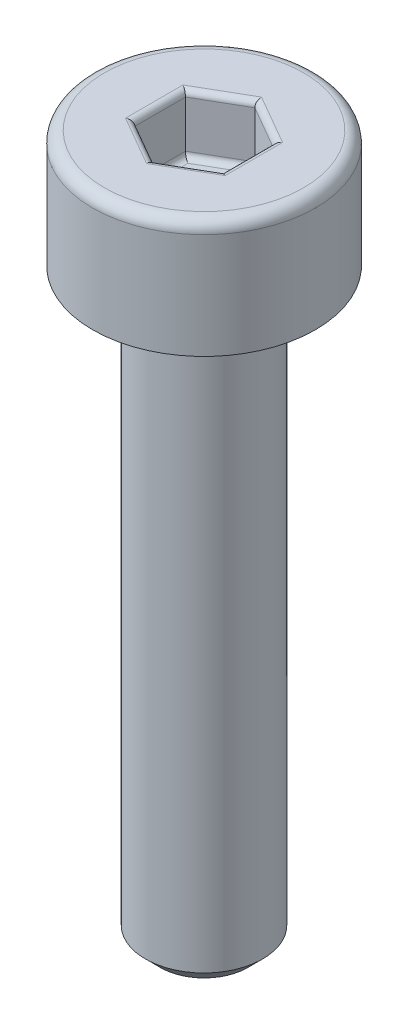
ISO-10303-21;
HEADER;
FILE_DESCRIPTION(('STEP AP214'),'2;1');
FILE_NAME('part.step','',(''),(''),'','','');
FILE_SCHEMA(('AUTOMOTIVE_DESIGN { 1 0 10303 214 1 1 1 1 }'));
ENDSEC;
DATA;
#1=APPLICATION_CONTEXT('core data for automotive mechanical design processes');
#2=APPLICATION_PROTOCOL_DEFINITION('international standard','automotive_design',2000,#1);
#3=PRODUCT_CONTEXT('',#1,'mechanical');
#4=PRODUCT('Part','Part','',(#3));
#5=PRODUCT_RELATED_PRODUCT_CATEGORY('part','',(#4));
#6=PRODUCT_DEFINITION_FORMATION('','',#4);
#7=PRODUCT_DEFINITION_CONTEXT('part definition',#1,'design');
#8=PRODUCT_DEFINITION('design','',#6,#7);
#9=PRODUCT_DEFINITION_SHAPE('','',#8);
#10=(LENGTH_UNIT() NAMED_UNIT(*) SI_UNIT(.MILLI.,.METRE.));
#11=(NAMED_UNIT(*) PLANE_ANGLE_UNIT() SI_UNIT($,.RADIAN.));
#12=(NAMED_UNIT(*) SI_UNIT($,.STERADIAN.) SOLID_ANGLE_UNIT());
#13=UNCERTAINTY_MEASURE_WITH_UNIT(LENGTH_MEASURE(1.E-05),#10,'distance_accuracy_value','');
#14=(GEOMETRIC_REPRESENTATION_CONTEXT(3) GLOBAL_UNCERTAINTY_ASSIGNED_CONTEXT((#13)) GLOBAL_UNIT_ASSIGNED_CONTEXT((#10,
#11,#12)) REPRESENTATION_CONTEXT('',''));
#15=CARTESIAN_POINT('',(0.,0.,0.));
#16=DIRECTION('',(0.,0.,1.));
#17=DIRECTION('',(1.,0.,0.));
#18=AXIS2_PLACEMENT_3D('',#15,#16,#17);
#19=CARTESIAN_POINT('',(0.,-12.,0.));
#20=DIRECTION('',(0.,-1.,0.));
#21=DIRECTION('',(0.,0.,-1.));
#22=AXIS2_PLACEMENT_3D('',#19,#20,#21);
#23=PLANE('',#22);
#24=CARTESIAN_POINT('',(0.,-12.,0.));
#25=DIRECTION('',(0.,-1.,0.));
#26=DIRECTION('',(0.,0.,-1.));
#27=AXIS2_PLACEMENT_3D('',#24,#25,#26);
#28=CIRCLE('',#27,0.749999999999995);
#29=CARTESIAN_POINT('',(0.,-12.,-0.749999999999995));
#30=VERTEX_POINT('',#29);
#31=EDGE_CURVE('E262',#30,#30,#28,.T.);
#32=ORIENTED_EDGE('',*,*,#31,.T.);
#33=EDGE_LOOP('',(#32));
#34=FACE_BOUND('',#33,.T.);
#35=ADVANCED_FACE('F34',(#34),#23,.T.);
#36=CARTESIAN_POINT('',(0.,0.,0.));
#37=DIRECTION('',(0.,1.,0.));
#38=DIRECTION('',(0.,0.,1.));
#39=AXIS2_PLACEMENT_3D('',#36,#37,#38);
#40=CYLINDRICAL_SURFACE('',#39,0.999999999999995);
#41=CARTESIAN_POINT('',(0.,-2.25,0.));
#42=DIRECTION('',(0.,-1.,0.));
#43=DIRECTION('',(0.,0.,-1.));
#44=AXIS2_PLACEMENT_3D('',#41,#42,#43);
#45=CIRCLE('',#44,0.999999999999995);
#46=CARTESIAN_POINT('',(0.,-2.25,-0.999999999999995));
#47=VERTEX_POINT('',#46);
#48=EDGE_CURVE('E259',#47,#47,#45,.T.);
#49=ORIENTED_EDGE('',*,*,#48,.T.);
#50=EDGE_LOOP('',(#49));
#51=FACE_BOUND('',#50,.T.);
#52=CARTESIAN_POINT('',(0.,-11.75,0.));
#53=DIRECTION('',(0.,-1.,0.));
#54=DIRECTION('',(0.,0.,-1.));
#55=AXIS2_PLACEMENT_3D('',#52,#53,#54);
#56=CIRCLE('',#55,0.999999999999995);
#57=CARTESIAN_POINT('',(0.,-11.75,-0.999999999999995));
#58=VERTEX_POINT('',#57);
#59=EDGE_CURVE('E256',#58,#58,#56,.F.);
#60=ORIENTED_EDGE('',*,*,#59,.T.);
#61=EDGE_LOOP('',(#60));
#62=FACE_BOUND('',#61,.T.);
#63=ADVANCED_FACE('F288',(#51,#62),#40,.T.);
#64=CARTESIAN_POINT('',(-0.999999999999995,-2.,0.));
#65=DIRECTION('',(0.,-1.,0.));
#66=DIRECTION('',(0.,0.,-1.));
#67=AXIS2_PLACEMENT_3D('',#64,#65,#66);
#68=PLANE('',#67);
#69=CARTESIAN_POINT('',(0.,-2.,0.));
#70=DIRECTION('',(0.,-1.,0.));
#71=DIRECTION('',(0.,0.,-1.));
#72=AXIS2_PLACEMENT_3D('',#69,#70,#71);
#73=CIRCLE('',#72,1.25);
#74=CARTESIAN_POINT('',(0.,-2.,-1.25));
#75=VERTEX_POINT('',#74);
#76=EDGE_CURVE('E253',#75,#75,#73,.F.);
#77=ORIENTED_EDGE('',*,*,#76,.T.);
#78=EDGE_LOOP('',(#77));
#79=FACE_BOUND('',#78,.T.);
#80=CARTESIAN_POINT('',(0.,-2.,0.));
#81=DIRECTION('',(0.,1.,0.));
#82=DIRECTION('',(0.,0.,1.));
#83=AXIS2_PLACEMENT_3D('',#80,#81,#82);
#84=CIRCLE('',#83,1.9);
#85=CARTESIAN_POINT('',(0.,-2.,1.9));
#86=VERTEX_POINT('',#85);
#87=EDGE_CURVE('E250',#86,#86,#84,.T.);
#88=ORIENTED_EDGE('',*,*,#87,.F.);
#89=EDGE_LOOP('',(#88));
#90=FACE_BOUND('',#89,.T.);
#91=ADVANCED_FACE('F294',(#79,#90),#68,.T.);
#92=CARTESIAN_POINT('',(0.,0.,0.));
#93=DIRECTION('',(0.,1.,0.));
#94=DIRECTION('',(0.,0.,1.));
#95=AXIS2_PLACEMENT_3D('',#92,#93,#94);
#96=CYLINDRICAL_SURFACE('',#95,1.9);
#97=CARTESIAN_POINT('',(0.,-0.2,0.));
#98=DIRECTION('',(0.,1.,0.));
#99=DIRECTION('',(0.,0.,1.));
#100=AXIS2_PLACEMENT_3D('',#97,#98,#99);
#101=CIRCLE('',#100,1.9);
#102=CARTESIAN_POINT('',(0.,-0.2,1.9));
#103=VERTEX_POINT('',#102);
#104=EDGE_CURVE('E160',#103,#103,#101,.F.);
#105=ORIENTED_EDGE('',*,*,#104,.T.);
#106=EDGE_LOOP('',(#105));
#107=FACE_BOUND('',#106,.T.);
#108=ORIENTED_EDGE('',*,*,#87,.T.);
#109=EDGE_LOOP('',(#108));
#110=FACE_BOUND('',#109,.T.);
#111=ADVANCED_FACE('F304',(#107,#110),#96,.T.);
#112=CARTESIAN_POINT('',(-1.9,0.,0.));
#113=DIRECTION('',(0.,1.,0.));
#114=DIRECTION('',(0.,0.,1.));
#115=AXIS2_PLACEMENT_3D('',#112,#113,#114);
#116=PLANE('',#115);
#117=DIRECTION('',(0.,0.,1.));
#118=VECTOR('',#117,1.);
#119=CARTESIAN_POINT('',(-0.850000000000001,0.,-0.433012701892221));
#120=LINE('',#119,#118);
#121=CARTESIAN_POINT('',(-0.850000000000001,0.,0.490747728811181));
#122=VERTEX_POINT('',#121);
#123=CARTESIAN_POINT('',(-0.850000000000001,0.,-0.490747728811183));
#124=VERTEX_POINT('',#123);
#125=EDGE_CURVE('E176',#122,#124,#120,.F.);
#126=ORIENTED_EDGE('',*,*,#125,.T.);
#127=DIRECTION('',(-0.866025403784438,0.,0.500000000000001));
#128=VECTOR('',#127,1.);
#129=CARTESIAN_POINT('',(-0.0500000000000018,0.,-0.952627944162884));
#130=LINE('',#129,#128);
#131=CARTESIAN_POINT('',(0.,0.,-0.981495457622365));
#132=VERTEX_POINT('',#131);
#133=EDGE_CURVE('E135',#124,#132,#130,.F.);
#134=ORIENTED_EDGE('',*,*,#133,.T.);
#135=DIRECTION('',(-0.866025403784439,0.,-0.5));
#136=VECTOR('',#135,1.);
#137=CARTESIAN_POINT('',(0.799999999999999,0.,-0.519615242270664));
#138=LINE('',#137,#136);
#139=CARTESIAN_POINT('',(0.849999999999999,0.,-0.490747728811183));
#140=VERTEX_POINT('',#139);
#141=EDGE_CURVE('E162',#132,#140,#138,.F.);
#142=ORIENTED_EDGE('',*,*,#141,.T.);
#143=DIRECTION('',(0.,0.,-1.));
#144=VECTOR('',#143,1.);
#145=CARTESIAN_POINT('',(0.85,0.,0.433012701892218));
#146=LINE('',#145,#144);
#147=CARTESIAN_POINT('',(0.85,0.,0.490747728811181));
#148=VERTEX_POINT('',#147);
#149=EDGE_CURVE('E170',#140,#148,#146,.F.);
#150=ORIENTED_EDGE('',*,*,#149,.T.);
#151=DIRECTION('',(0.866025403784439,0.,-0.499999999999999));
#152=VECTOR('',#151,1.);
#153=CARTESIAN_POINT('',(0.0499999999999988,0.,0.952627944162882));
#154=LINE('',#153,#152);
#155=CARTESIAN_POINT('',(0.,0.,0.981495457622363));
#156=VERTEX_POINT('',#155);
#157=EDGE_CURVE('E172',#148,#156,#154,.F.);
#158=ORIENTED_EDGE('',*,*,#157,.T.);
#159=DIRECTION('',(0.866025403784439,0.,0.5));
#160=VECTOR('',#159,1.);
#161=CARTESIAN_POINT('',(-0.800000000000001,0.,0.519615242270662));
#162=LINE('',#161,#160);
#163=EDGE_CURVE('E174',#156,#122,#162,.F.);
#164=ORIENTED_EDGE('',*,*,#163,.T.);
#165=EDGE_LOOP('',(#126,#134,#142,#150,#158,#164));
#166=FACE_BOUND('',#165,.T.);
#167=CARTESIAN_POINT('',(0.,0.,0.));
#168=DIRECTION('',(0.,1.,0.));
#169=DIRECTION('',(0.,0.,1.));
#170=AXIS2_PLACEMENT_3D('',#167,#168,#169);
#171=CIRCLE('',#170,1.7);
#172=CARTESIAN_POINT('',(0.,0.,1.7));
#173=VERTEX_POINT('',#172);
#174=EDGE_CURVE('E165',#173,#173,#171,.T.);
#175=ORIENTED_EDGE('',*,*,#174,.T.);
#176=EDGE_LOOP('',(#175));
#177=FACE_BOUND('',#176,.T.);
#178=ADVANCED_FACE('F267',(#166,#177),#116,.T.);
#179=CARTESIAN_POINT('',(0.,-2.,0.));
#180=DIRECTION('',(0.,1.,0.));
#181=DIRECTION('',(0.,0.,1.));
#182=AXIS2_PLACEMENT_3D('',#179,#180,#181);
#183=CONICAL_SURFACE('',#182,1.25,0.785398163397455);
#184=ORIENTED_EDGE('',*,*,#48,.F.);
#185=EDGE_LOOP('',(#184));
#186=FACE_BOUND('',#185,.T.);
#187=ORIENTED_EDGE('',*,*,#76,.F.);
#188=EDGE_LOOP('',(#187));
#189=FACE_BOUND('',#188,.T.);
#190=ADVANCED_FACE('F282',(#186,#189),#183,.T.);
#191=CARTESIAN_POINT('',(0.,-11.75,0.));
#192=DIRECTION('',(0.,1.,0.));
#193=DIRECTION('',(0.,0.,1.));
#194=AXIS2_PLACEMENT_3D('',#191,#192,#193);
#195=CONICAL_SURFACE('',#194,0.999999999999995,0.785398163397453);
#196=ORIENTED_EDGE('',*,*,#31,.F.);
#197=EDGE_LOOP('',(#196));
#198=FACE_BOUND('',#197,.T.);
#199=ORIENTED_EDGE('',*,*,#59,.F.);
#200=EDGE_LOOP('',(#199));
#201=FACE_BOUND('',#200,.T.);
#202=ADVANCED_FACE('F272',(#198,#201),#195,.T.);
#203=CARTESIAN_POINT('',(0.,-0.2,0.));
#204=DIRECTION('',(0.,1.,0.));
#205=DIRECTION('',(0.,0.,1.));
#206=AXIS2_PLACEMENT_3D('',#203,#204,#205);
#207=TOROIDAL_SURFACE('',#206,1.7,0.2);
#208=ORIENTED_EDGE('',*,*,#104,.F.);
#209=EDGE_LOOP('',(#208));
#210=FACE_BOUND('',#209,.T.);
#211=ORIENTED_EDGE('',*,*,#174,.F.);
#212=EDGE_LOOP('',(#211));
#213=FACE_BOUND('',#212,.T.);
#214=ADVANCED_FACE('F269',(#210,#213),#207,.T.);
#215=CARTESIAN_POINT('',(0.749999999999999,-1.,-0.433012701892221));
#216=DIRECTION('',(0.5,0.,-0.866025403784439));
#217=DIRECTION('',(-0.866025403784439,0.,-0.5));
#218=AXIS2_PLACEMENT_3D('',#215,#216,#217);
#219=PLANE('',#218);
#220=DIRECTION('',(0.,1.,0.));
#221=VECTOR('',#220,1.);
#222=CARTESIAN_POINT('',(0.749999999999999,-1.,-0.433012701892221));
#223=LINE('',#222,#221);
#224=CARTESIAN_POINT('',(0.749999999999999,-0.9,-0.433012701892221));
#225=VERTEX_POINT('',#224);
#226=CARTESIAN_POINT('',(0.749999999999999,-0.1,-0.433012701892221));
#227=VERTEX_POINT('',#226);
#228=EDGE_CURVE('E244',#225,#227,#223,.T.);
#229=ORIENTED_EDGE('',*,*,#228,.T.);
#230=DIRECTION('',(-0.866025403784439,0.,-0.5));
#231=VECTOR('',#230,1.);
#232=CARTESIAN_POINT('',(0.,-0.1,-0.86602540378444));
#233=LINE('',#232,#231);
#234=CARTESIAN_POINT('',(0.,-0.1,-0.86602540378444));
#235=VERTEX_POINT('',#234);
#236=EDGE_CURVE('E196',#227,#235,#233,.T.);
#237=ORIENTED_EDGE('',*,*,#236,.T.);
#238=DIRECTION('',(0.,1.,0.));
#239=VECTOR('',#238,1.);
#240=CARTESIAN_POINT('',(0.,-1.,-0.86602540378444));
#241=LINE('',#240,#239);
#242=CARTESIAN_POINT('',(0.,-0.9,-0.86602540378444));
#243=VERTEX_POINT('',#242);
#244=EDGE_CURVE('E146',#243,#235,#241,.T.);
#245=ORIENTED_EDGE('',*,*,#244,.F.);
#246=DIRECTION('',(-0.866025403784439,0.,-0.5));
#247=VECTOR('',#246,1.);
#248=CARTESIAN_POINT('',(0.749999999999999,-0.9,-0.433012701892221));
#249=LINE('',#248,#247);
#250=EDGE_CURVE('E194',#243,#225,#249,.F.);
#251=ORIENTED_EDGE('',*,*,#250,.T.);
#252=EDGE_LOOP('',(#229,#237,#245,#251));
#253=FACE_BOUND('',#252,.T.);
#254=ADVANCED_FACE('F271',(#253),#219,.F.);
#255=CARTESIAN_POINT('',(0.75,-1.,0.433012701892219));
#256=DIRECTION('',(1.,0.,0.));
#257=DIRECTION('',(0.,0.,-1.));
#258=AXIS2_PLACEMENT_3D('',#255,#256,#257);
#259=PLANE('',#258);
#260=DIRECTION('',(0.,1.,0.));
#261=VECTOR('',#260,1.);
#262=CARTESIAN_POINT('',(0.75,-1.,0.433012701892219));
#263=LINE('',#262,#261);
#264=CARTESIAN_POINT('',(0.75,-0.9,0.433012701892219));
#265=VERTEX_POINT('',#264);
#266=CARTESIAN_POINT('',(0.75,-0.1,0.433012701892219));
#267=VERTEX_POINT('',#266);
#268=EDGE_CURVE('E241',#265,#267,#263,.T.);
#269=ORIENTED_EDGE('',*,*,#268,.T.);
#270=DIRECTION('',(0.,0.,-1.));
#271=VECTOR('',#270,1.);
#272=CARTESIAN_POINT('',(0.749999999999999,-0.1,-0.433012701892221));
#273=LINE('',#272,#271);
#274=EDGE_CURVE('E192',#267,#227,#273,.T.);
#275=ORIENTED_EDGE('',*,*,#274,.T.);
#276=ORIENTED_EDGE('',*,*,#228,.F.);
#277=DIRECTION('',(0.,0.,-1.));
#278=VECTOR('',#277,1.);
#279=CARTESIAN_POINT('',(0.75,-0.9,0.433012701892219));
#280=LINE('',#279,#278);
#281=EDGE_CURVE('E189',#225,#265,#280,.F.);
#282=ORIENTED_EDGE('',*,*,#281,.T.);
#283=EDGE_LOOP('',(#269,#275,#276,#282));
#284=FACE_BOUND('',#283,.T.);
#285=ADVANCED_FACE('F279',(#284),#259,.F.);
#286=CARTESIAN_POINT('',(0.,-1.,0.866025403784438));
#287=DIRECTION('',(0.499999999999999,0.,0.866025403784439));
#288=DIRECTION('',(0.866025403784439,0.,-0.499999999999999));
#289=AXIS2_PLACEMENT_3D('',#286,#287,#288);
#290=PLANE('',#289);
#291=DIRECTION('',(0.,1.,0.));
#292=VECTOR('',#291,1.);
#293=CARTESIAN_POINT('',(0.,-1.,0.866025403784438));
#294=LINE('',#293,#292);
#295=CARTESIAN_POINT('',(0.,-0.9,0.866025403784438));
#296=VERTEX_POINT('',#295);
#297=CARTESIAN_POINT('',(0.,-0.1,0.866025403784438));
#298=VERTEX_POINT('',#297);
#299=EDGE_CURVE('E238',#296,#298,#294,.T.);
#300=ORIENTED_EDGE('',*,*,#299,.T.);
#301=DIRECTION('',(0.866025403784439,0.,-0.499999999999999));
#302=VECTOR('',#301,1.);
#303=CARTESIAN_POINT('',(0.75,-0.1,0.433012701892219));
#304=LINE('',#303,#302);
#305=EDGE_CURVE('E187',#298,#267,#304,.T.);
#306=ORIENTED_EDGE('',*,*,#305,.T.);
#307=ORIENTED_EDGE('',*,*,#268,.F.);
#308=DIRECTION('',(0.866025403784439,0.,-0.499999999999999));
#309=VECTOR('',#308,1.);
#310=CARTESIAN_POINT('',(0.,-0.9,0.866025403784438));
#311=LINE('',#310,#309);
#312=EDGE_CURVE('E185',#265,#296,#311,.F.);
#313=ORIENTED_EDGE('',*,*,#312,.T.);
#314=EDGE_LOOP('',(#300,#306,#307,#313));
#315=FACE_BOUND('',#314,.T.);
#316=ADVANCED_FACE('F328',(#315),#290,.F.);
#317=CARTESIAN_POINT('',(-0.750000000000001,-1.,0.433012701892218));
#318=DIRECTION('',(-0.5,0.,0.866025403784439));
#319=DIRECTION('',(0.866025403784439,0.,0.5));
#320=AXIS2_PLACEMENT_3D('',#317,#318,#319);
#321=PLANE('',#320);
#322=DIRECTION('',(0.,1.,0.));
#323=VECTOR('',#322,1.);
#324=CARTESIAN_POINT('',(-0.750000000000001,-1.,0.433012701892218));
#325=LINE('',#324,#323);
#326=CARTESIAN_POINT('',(-0.750000000000001,-0.9,0.433012701892218));
#327=VERTEX_POINT('',#326);
#328=CARTESIAN_POINT('',(-0.750000000000001,-0.1,0.433012701892218));
#329=VERTEX_POINT('',#328);
#330=EDGE_CURVE('E129',#327,#329,#325,.T.);
#331=ORIENTED_EDGE('',*,*,#330,.T.);
#332=DIRECTION('',(0.866025403784439,0.,0.5));
#333=VECTOR('',#332,1.);
#334=CARTESIAN_POINT('',(0.,-0.1,0.866025403784438));
#335=LINE('',#334,#333);
#336=EDGE_CURVE('E183',#329,#298,#335,.T.);
#337=ORIENTED_EDGE('',*,*,#336,.T.);
#338=ORIENTED_EDGE('',*,*,#299,.F.);
#339=DIRECTION('',(0.866025403784439,0.,0.5));
#340=VECTOR('',#339,1.);
#341=CARTESIAN_POINT('',(-0.750000000000001,-0.9,0.433012701892218));
#342=LINE('',#341,#340);
#343=EDGE_CURVE('E181',#296,#327,#342,.F.);
#344=ORIENTED_EDGE('',*,*,#343,.T.);
#345=EDGE_LOOP('',(#331,#337,#338,#344));
#346=FACE_BOUND('',#345,.T.);
#347=ADVANCED_FACE('F235',(#346),#321,.F.);
#348=CARTESIAN_POINT('',(-0.750000000000001,-1.,-0.433012701892221));
#349=DIRECTION('',(-1.,0.,0.));
#350=DIRECTION('',(0.,0.,1.));
#351=AXIS2_PLACEMENT_3D('',#348,#349,#350);
#352=PLANE('',#351);
#353=DIRECTION('',(0.,1.,0.));
#354=VECTOR('',#353,1.);
#355=CARTESIAN_POINT('',(-0.750000000000001,-1.,-0.433012701892221));
#356=LINE('',#355,#354);
#357=CARTESIAN_POINT('',(-0.750000000000001,-0.9,-0.433012701892221));
#358=VERTEX_POINT('',#357);
#359=CARTESIAN_POINT('',(-0.750000000000001,-0.1,-0.433012701892221));
#360=VERTEX_POINT('',#359);
#361=EDGE_CURVE('E127',#358,#360,#356,.T.);
#362=ORIENTED_EDGE('',*,*,#361,.T.);
#363=DIRECTION('',(0.,0.,1.));
#364=VECTOR('',#363,1.);
#365=CARTESIAN_POINT('',(-0.750000000000001,-0.1,0.433012701892218));
#366=LINE('',#365,#364);
#367=EDGE_CURVE('E134',#360,#329,#366,.T.);
#368=ORIENTED_EDGE('',*,*,#367,.T.);
#369=ORIENTED_EDGE('',*,*,#330,.F.);
#370=DIRECTION('',(0.,0.,1.));
#371=VECTOR('',#370,1.);
#372=CARTESIAN_POINT('',(-0.750000000000001,-0.9,-0.433012701892221));
#373=LINE('',#372,#371);
#374=EDGE_CURVE('E124',#327,#358,#373,.F.);
#375=ORIENTED_EDGE('',*,*,#374,.T.);
#376=EDGE_LOOP('',(#362,#368,#369,#375));
#377=FACE_BOUND('',#376,.T.);
#378=ADVANCED_FACE('F126',(#377),#352,.F.);
#379=CARTESIAN_POINT('',(0.,-1.,-0.86602540378444));
#380=DIRECTION('',(-0.500000000000001,0.,-0.866025403784438));
#381=DIRECTION('',(-0.866025403784438,0.,0.500000000000001));
#382=AXIS2_PLACEMENT_3D('',#379,#380,#381);
#383=PLANE('',#382);
#384=ORIENTED_EDGE('',*,*,#244,.T.);
#385=DIRECTION('',(-0.866025403784438,0.,0.500000000000001));
#386=VECTOR('',#385,1.);
#387=CARTESIAN_POINT('',(-0.750000000000001,-0.1,-0.43301270189222));
#388=LINE('',#387,#386);
#389=EDGE_CURVE('E145',#235,#360,#388,.T.);
#390=ORIENTED_EDGE('',*,*,#389,.T.);
#391=ORIENTED_EDGE('',*,*,#361,.F.);
#392=DIRECTION('',(-0.866025403784438,0.,0.500000000000001));
#393=VECTOR('',#392,1.);
#394=CARTESIAN_POINT('',(0.,-0.9,-0.86602540378444));
#395=LINE('',#394,#393);
#396=EDGE_CURVE('E142',#358,#243,#395,.F.);
#397=ORIENTED_EDGE('',*,*,#396,.T.);
#398=EDGE_LOOP('',(#384,#390,#391,#397));
#399=FACE_BOUND('',#398,.T.);
#400=ADVANCED_FACE('F140',(#399),#383,.F.);
#401=CARTESIAN_POINT('',(0.,-1.,-0.86602540378444));
#402=DIRECTION('',(0.,1.,0.));
#403=DIRECTION('',(0.,0.,1.));
#404=AXIS2_PLACEMENT_3D('',#401,#402,#403);
#405=PLANE('',#404);
#406=DIRECTION('',(0.866025403784439,0.,-0.499999999999999));
#407=VECTOR('',#406,1.);
#408=CARTESIAN_POINT('',(0.699999999999998,-1.,0.346410161513776));
#409=LINE('',#408,#407);
#410=CARTESIAN_POINT('',(0.,-1.,0.750555349946512));
#411=VERTEX_POINT('',#410);
#412=CARTESIAN_POINT('',(0.65,-1.,0.375277674973256));
#413=VERTEX_POINT('',#412);
#414=EDGE_CURVE('E43',#411,#413,#409,.T.);
#415=ORIENTED_EDGE('',*,*,#414,.T.);
#416=DIRECTION('',(0.,0.,-1.));
#417=VECTOR('',#416,1.);
#418=CARTESIAN_POINT('',(0.649999999999998,-1.,-0.866025403784441));
#419=LINE('',#418,#417);
#420=CARTESIAN_POINT('',(0.649999999999999,-1.,-0.375277674973258));
#421=VERTEX_POINT('',#420);
#422=EDGE_CURVE('E11',#413,#421,#419,.T.);
#423=ORIENTED_EDGE('',*,*,#422,.T.);
#424=DIRECTION('',(-0.866025403784439,0.,-0.5));
#425=VECTOR('',#424,1.);
#426=CARTESIAN_POINT('',(-0.0500000000000017,-1.,-0.779422863405996));
#427=LINE('',#426,#425);
#428=CARTESIAN_POINT('',(0.,-1.,-0.750555349946515));
#429=VERTEX_POINT('',#428);
#430=EDGE_CURVE('E198',#421,#429,#427,.T.);
#431=ORIENTED_EDGE('',*,*,#430,.T.);
#432=DIRECTION('',(-0.866025403784438,0.,0.500000000000001));
#433=VECTOR('',#432,1.);
#434=CARTESIAN_POINT('',(0.0499999999999984,-1.,-0.779422863405996));
#435=LINE('',#434,#433);
#436=CARTESIAN_POINT('',(-0.650000000000001,-1.,-0.375277674973258));
#437=VERTEX_POINT('',#436);
#438=EDGE_CURVE('E200',#429,#437,#435,.T.);
#439=ORIENTED_EDGE('',*,*,#438,.T.);
#440=DIRECTION('',(0.,0.,1.));
#441=VECTOR('',#440,1.);
#442=CARTESIAN_POINT('',(-0.650000000000001,-1.,-0.86602540378444));
#443=LINE('',#442,#441);
#444=CARTESIAN_POINT('',(-0.650000000000001,-1.,0.375277674973256));
#445=VERTEX_POINT('',#444);
#446=EDGE_CURVE('E151',#437,#445,#443,.T.);
#447=ORIENTED_EDGE('',*,*,#446,.T.);
#448=DIRECTION('',(0.866025403784439,0.,0.5));
#449=VECTOR('',#448,1.);
#450=CARTESIAN_POINT('',(-0.700000000000002,-1.,0.346410161513774));
#451=LINE('',#450,#449);
#452=EDGE_CURVE('E54',#445,#411,#451,.T.);
#453=ORIENTED_EDGE('',*,*,#452,.T.);
#454=EDGE_LOOP('',(#415,#423,#431,#439,#447,#453));
#455=FACE_BOUND('',#454,.T.);
#456=ADVANCED_FACE('F323',(#455),#405,.T.);
#457=CARTESIAN_POINT('',(0.0499999999999988,-0.1,0.952627944162882));
#458=DIRECTION('',(-0.866025403784439,0.,0.499999999999999));
#459=DIRECTION('',(0.499999999999999,0.,0.866025403784439));
#460=AXIS2_PLACEMENT_3D('',#457,#458,#459);
#461=CYLINDRICAL_SURFACE('',#460,0.1);
#462=CARTESIAN_POINT('',(0.,-0.1,0.981495457622363));
#463=DIRECTION('',(-1.,0.,0.));
#464=DIRECTION('',(0.,0.,-1.));
#465=AXIS2_PLACEMENT_3D('',#462,#463,#464);
#466=ELLIPSE('',#465,0.115470053837925,0.1);
#467=EDGE_CURVE('E215',#156,#298,#466,.T.);
#468=ORIENTED_EDGE('',*,*,#467,.F.);
#469=ORIENTED_EDGE('',*,*,#157,.F.);
#470=CARTESIAN_POINT('',(0.85,-0.1,0.490747728811181));
#471=DIRECTION('',(-0.5,0.,0.866025403784439));
#472=DIRECTION('',(-0.866025403784439,0.,-0.5));
#473=AXIS2_PLACEMENT_3D('',#470,#471,#472);
#474=ELLIPSE('',#473,0.115470053837925,0.1);
#475=EDGE_CURVE('E218',#267,#148,#474,.F.);
#476=ORIENTED_EDGE('',*,*,#475,.F.);
#477=ORIENTED_EDGE('',*,*,#305,.F.);
#478=EDGE_LOOP('',(#468,#469,#476,#477));
#479=FACE_BOUND('',#478,.T.);
#480=ADVANCED_FACE('F335',(#479),#461,.T.);
#481=CARTESIAN_POINT('',(0.85,-0.1,0.433012701892218));
#482=DIRECTION('',(0.,0.,1.));
#483=DIRECTION('',(1.,0.,0.));
#484=AXIS2_PLACEMENT_3D('',#481,#482,#483);
#485=CYLINDRICAL_SURFACE('',#484,0.1);
#486=ORIENTED_EDGE('',*,*,#475,.T.);
#487=ORIENTED_EDGE('',*,*,#149,.F.);
#488=CARTESIAN_POINT('',(0.849999999999999,-0.1,-0.490747728811183));
#489=DIRECTION('',(0.5,0.,0.866025403784438));
#490=DIRECTION('',(-0.866025403784438,0.,0.500000000000001));
#491=AXIS2_PLACEMENT_3D('',#488,#489,#490);
#492=ELLIPSE('',#491,0.115470053837925,0.1);
#493=EDGE_CURVE('E212',#227,#140,#492,.F.);
#494=ORIENTED_EDGE('',*,*,#493,.F.);
#495=ORIENTED_EDGE('',*,*,#274,.F.);
#496=EDGE_LOOP('',(#486,#487,#494,#495));
#497=FACE_BOUND('',#496,.T.);
#498=ADVANCED_FACE('F339',(#497),#485,.T.);
#499=CARTESIAN_POINT('',(-0.800000000000001,-0.1,0.519615242270662));
#500=DIRECTION('',(-0.866025403784439,0.,-0.5));
#501=DIRECTION('',(-0.5,0.,0.866025403784439));
#502=AXIS2_PLACEMENT_3D('',#499,#500,#501);
#503=CYLINDRICAL_SURFACE('',#502,0.1);
#504=ORIENTED_EDGE('',*,*,#467,.T.);
#505=ORIENTED_EDGE('',*,*,#336,.F.);
#506=CARTESIAN_POINT('',(-0.850000000000001,-0.1,0.490747728811181));
#507=DIRECTION('',(-0.5,0.,-0.866025403784439));
#508=DIRECTION('',(0.866025403784439,0.,-0.5));
#509=AXIS2_PLACEMENT_3D('',#506,#507,#508);
#510=ELLIPSE('',#509,0.115470053837925,0.1);
#511=EDGE_CURVE('E209',#122,#329,#510,.T.);
#512=ORIENTED_EDGE('',*,*,#511,.F.);
#513=ORIENTED_EDGE('',*,*,#163,.F.);
#514=EDGE_LOOP('',(#504,#505,#512,#513));
#515=FACE_BOUND('',#514,.T.);
#516=ADVANCED_FACE('F345',(#515),#503,.T.);
#517=CARTESIAN_POINT('',(0.799999999999999,-0.1,-0.519615242270664));
#518=DIRECTION('',(0.866025403784439,0.,0.5));
#519=DIRECTION('',(0.5,0.,-0.866025403784439));
#520=AXIS2_PLACEMENT_3D('',#517,#518,#519);
#521=CYLINDRICAL_SURFACE('',#520,0.1);
#522=ORIENTED_EDGE('',*,*,#493,.T.);
#523=ORIENTED_EDGE('',*,*,#141,.F.);
#524=CARTESIAN_POINT('',(0.,-0.1,-0.981495457622365));
#525=DIRECTION('',(1.,0.,0.));
#526=DIRECTION('',(0.,0.,-1.));
#527=AXIS2_PLACEMENT_3D('',#524,#525,#526);
#528=ELLIPSE('',#527,0.115470053837925,0.1);
#529=EDGE_CURVE('E207',#235,#132,#528,.F.);
#530=ORIENTED_EDGE('',*,*,#529,.F.);
#531=ORIENTED_EDGE('',*,*,#236,.F.);
#532=EDGE_LOOP('',(#522,#523,#530,#531));
#533=FACE_BOUND('',#532,.T.);
#534=ADVANCED_FACE('F375',(#533),#521,.T.);
#535=CARTESIAN_POINT('',(-0.850000000000001,-0.1,-0.433012701892221));
#536=DIRECTION('',(0.,0.,-1.));
#537=DIRECTION('',(-1.,0.,0.));
#538=AXIS2_PLACEMENT_3D('',#535,#536,#537);
#539=CYLINDRICAL_SURFACE('',#538,0.1);
#540=ORIENTED_EDGE('',*,*,#511,.T.);
#541=ORIENTED_EDGE('',*,*,#367,.F.);
#542=CARTESIAN_POINT('',(-0.850000000000001,-0.1,-0.490747728811183));
#543=DIRECTION('',(0.5,0.,-0.866025403784439));
#544=DIRECTION('',(0.866025403784439,0.,0.5));
#545=AXIS2_PLACEMENT_3D('',#542,#543,#544);
#546=ELLIPSE('',#545,0.115470053837925,0.1);
#547=EDGE_CURVE('E205',#124,#360,#546,.T.);
#548=ORIENTED_EDGE('',*,*,#547,.F.);
#549=ORIENTED_EDGE('',*,*,#125,.F.);
#550=EDGE_LOOP('',(#540,#541,#548,#549));
#551=FACE_BOUND('',#550,.T.);
#552=ADVANCED_FACE('F370',(#551),#539,.T.);
#553=CARTESIAN_POINT('',(-0.0500000000000018,-0.1,-0.952627944162884));
#554=DIRECTION('',(0.866025403784438,0.,-0.500000000000001));
#555=DIRECTION('',(-0.500000000000001,0.,-0.866025403784438));
#556=AXIS2_PLACEMENT_3D('',#553,#554,#555);
#557=CYLINDRICAL_SURFACE('',#556,0.1);
#558=ORIENTED_EDGE('',*,*,#529,.T.);
#559=ORIENTED_EDGE('',*,*,#133,.F.);
#560=ORIENTED_EDGE('',*,*,#547,.T.);
#561=ORIENTED_EDGE('',*,*,#389,.F.);
#562=EDGE_LOOP('',(#558,#559,#560,#561));
#563=FACE_BOUND('',#562,.T.);
#564=ADVANCED_FACE('F366',(#563),#557,.T.);
#565=CARTESIAN_POINT('',(-0.650000000000001,-0.9,-0.86602540378444));
#566=DIRECTION('',(0.,0.,1.));
#567=DIRECTION('',(1.,0.,0.));
#568=AXIS2_PLACEMENT_3D('',#565,#566,#567);
#569=CYLINDRICAL_SURFACE('',#568,0.1);
#570=CARTESIAN_POINT('',(-0.650000000000001,-0.9,-0.375277674973258));
#571=DIRECTION('',(-0.5,0.,0.866025403784439));
#572=DIRECTION('',(0.866025403784439,0.,0.5));
#573=AXIS2_PLACEMENT_3D('',#570,#571,#572);
#574=ELLIPSE('',#573,0.115470053837925,0.1);
#575=EDGE_CURVE('E150',#358,#437,#574,.T.);
#576=ORIENTED_EDGE('',*,*,#575,.F.);
#577=ORIENTED_EDGE('',*,*,#374,.F.);
#578=CARTESIAN_POINT('',(-0.650000000000001,-0.9,0.375277674973256));
#579=DIRECTION('',(0.5,0.,0.866025403784439));
#580=DIRECTION('',(0.866025403784439,0.,-0.5));
#581=AXIS2_PLACEMENT_3D('',#578,#579,#580);
#582=ELLIPSE('',#581,0.115470053837925,0.1);
#583=EDGE_CURVE('E38',#445,#327,#582,.F.);
#584=ORIENTED_EDGE('',*,*,#583,.F.);
#585=ORIENTED_EDGE('',*,*,#446,.F.);
#586=EDGE_LOOP('',(#576,#577,#584,#585));
#587=FACE_BOUND('',#586,.T.);
#588=ADVANCED_FACE('F36',(#587),#569,.F.);
#589=CARTESIAN_POINT('',(-0.700000000000002,-0.9,0.346410161513774));
#590=DIRECTION('',(0.866025403784439,0.,0.5));
#591=DIRECTION('',(0.5,0.,-0.866025403784439));
#592=AXIS2_PLACEMENT_3D('',#589,#590,#591);
#593=CYLINDRICAL_SURFACE('',#592,0.1);
#594=ORIENTED_EDGE('',*,*,#583,.T.);
#595=ORIENTED_EDGE('',*,*,#343,.F.);
#596=CARTESIAN_POINT('',(0.,-0.9,0.750555349946512));
#597=DIRECTION('',(1.,0.,0.));
#598=DIRECTION('',(0.,0.,-1.));
#599=AXIS2_PLACEMENT_3D('',#596,#597,#598);
#600=ELLIPSE('',#599,0.115470053837925,0.1);
#601=EDGE_CURVE('E154',#411,#296,#600,.F.);
#602=ORIENTED_EDGE('',*,*,#601,.F.);
#603=ORIENTED_EDGE('',*,*,#452,.F.);
#604=EDGE_LOOP('',(#594,#595,#602,#603));
#605=FACE_BOUND('',#604,.T.);
#606=ADVANCED_FACE('F232',(#605),#593,.F.);
#607=CARTESIAN_POINT('',(0.0499999999999983,-0.9,-0.779422863405996));
#608=DIRECTION('',(-0.866025403784438,0.,0.500000000000001));
#609=DIRECTION('',(0.500000000000001,0.,0.866025403784438));
#610=AXIS2_PLACEMENT_3D('',#607,#608,#609);
#611=CYLINDRICAL_SURFACE('',#610,0.1);
#612=ORIENTED_EDGE('',*,*,#575,.T.);
#613=ORIENTED_EDGE('',*,*,#438,.F.);
#614=CARTESIAN_POINT('',(0.,-0.9,-0.750555349946515));
#615=DIRECTION('',(-1.,0.,0.));
#616=DIRECTION('',(0.,0.,1.));
#617=AXIS2_PLACEMENT_3D('',#614,#615,#616);
#618=ELLIPSE('',#617,0.115470053837925,0.1);
#619=EDGE_CURVE('E158',#243,#429,#618,.T.);
#620=ORIENTED_EDGE('',*,*,#619,.F.);
#621=ORIENTED_EDGE('',*,*,#396,.F.);
#622=EDGE_LOOP('',(#612,#613,#620,#621));
#623=FACE_BOUND('',#622,.T.);
#624=ADVANCED_FACE('F156',(#623),#611,.F.);
#625=CARTESIAN_POINT('',(0.699999999999998,-0.9,0.346410161513776));
#626=DIRECTION('',(0.866025403784439,0.,-0.499999999999999));
#627=DIRECTION('',(-0.499999999999999,0.,-0.866025403784439));
#628=AXIS2_PLACEMENT_3D('',#625,#626,#627);
#629=CYLINDRICAL_SURFACE('',#628,0.1);
#630=ORIENTED_EDGE('',*,*,#601,.T.);
#631=ORIENTED_EDGE('',*,*,#312,.F.);
#632=CARTESIAN_POINT('',(0.65,-0.9,0.375277674973256));
#633=DIRECTION('',(0.5,0.,-0.866025403784439));
#634=DIRECTION('',(-0.866025403784439,0.,-0.5));
#635=AXIS2_PLACEMENT_3D('',#632,#633,#634);
#636=ELLIPSE('',#635,0.115470053837925,0.1);
#637=EDGE_CURVE('E223',#413,#265,#636,.F.);
#638=ORIENTED_EDGE('',*,*,#637,.F.);
#639=ORIENTED_EDGE('',*,*,#414,.F.);
#640=EDGE_LOOP('',(#630,#631,#638,#639));
#641=FACE_BOUND('',#640,.T.);
#642=ADVANCED_FACE('F229',(#641),#629,.F.);
#643=CARTESIAN_POINT('',(-0.0500000000000018,-0.9,-0.779422863405996));
#644=DIRECTION('',(-0.866025403784439,0.,-0.5));
#645=DIRECTION('',(-0.5,0.,0.866025403784439));
#646=AXIS2_PLACEMENT_3D('',#643,#644,#645);
#647=CYLINDRICAL_SURFACE('',#646,0.1);
#648=ORIENTED_EDGE('',*,*,#619,.T.);
#649=ORIENTED_EDGE('',*,*,#430,.F.);
#650=CARTESIAN_POINT('',(0.649999999999999,-0.9,-0.375277674973258));
#651=DIRECTION('',(-0.5,0.,-0.866025403784438));
#652=DIRECTION('',(0.866025403784438,0.,-0.500000000000001));
#653=AXIS2_PLACEMENT_3D('',#650,#651,#652);
#654=ELLIPSE('',#653,0.115470053837925,0.1);
#655=EDGE_CURVE('E221',#225,#421,#654,.T.);
#656=ORIENTED_EDGE('',*,*,#655,.F.);
#657=ORIENTED_EDGE('',*,*,#250,.F.);
#658=EDGE_LOOP('',(#648,#649,#656,#657));
#659=FACE_BOUND('',#658,.T.);
#660=ADVANCED_FACE('F354',(#659),#647,.F.);
#661=CARTESIAN_POINT('',(0.649999999999998,-0.9,-0.866025403784441));
#662=DIRECTION('',(0.,0.,-1.));
#663=DIRECTION('',(-1.,0.,0.));
#664=AXIS2_PLACEMENT_3D('',#661,#662,#663);
#665=CYLINDRICAL_SURFACE('',#664,0.1);
#666=ORIENTED_EDGE('',*,*,#637,.T.);
#667=ORIENTED_EDGE('',*,*,#281,.F.);
#668=ORIENTED_EDGE('',*,*,#655,.T.);
#669=ORIENTED_EDGE('',*,*,#422,.F.);
#670=EDGE_LOOP('',(#666,#667,#668,#669));
#671=FACE_BOUND('',#670,.T.);
#672=ADVANCED_FACE('F351',(#671),#665,.F.);
#673=CLOSED_SHELL('',(#35,#63,#91,#111,#178,#190,#202,#214,#254,#285,#316,#347,#378,#400,#456,
#480,#498,#516,#534,#552,#564,#588,#606,#624,#642,#660,#672));
#674=MANIFOLD_SOLID_BREP('B2',#673);
#675=ADVANCED_BREP_SHAPE_REPRESENTATION('',(#18,#674),#14);
#676=SHAPE_DEFINITION_REPRESENTATION(#9,#675);
ENDSEC;
END-ISO-10303-21;
